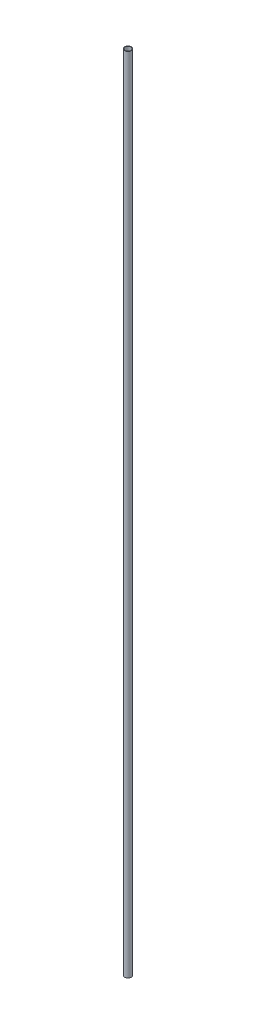
ISO-10303-21;
HEADER;
FILE_DESCRIPTION(('STEP AP214'),'2;1');
FILE_NAME('part.step','',(''),(''),'','','');
FILE_SCHEMA(('AUTOMOTIVE_DESIGN { 1 0 10303 214 1 1 1 1 }'));
ENDSEC;
DATA;
#1=APPLICATION_CONTEXT('core data for automotive mechanical design processes');
#2=APPLICATION_PROTOCOL_DEFINITION('international standard','automotive_design',2000,#1);
#3=PRODUCT_CONTEXT('',#1,'mechanical');
#4=PRODUCT('Part','Part','',(#3));
#5=PRODUCT_RELATED_PRODUCT_CATEGORY('part','',(#4));
#6=PRODUCT_DEFINITION_FORMATION('','',#4);
#7=PRODUCT_DEFINITION_CONTEXT('part definition',#1,'design');
#8=PRODUCT_DEFINITION('design','',#6,#7);
#9=PRODUCT_DEFINITION_SHAPE('','',#8);
#10=(LENGTH_UNIT() NAMED_UNIT(*) SI_UNIT(.MILLI.,.METRE.));
#11=(NAMED_UNIT(*) PLANE_ANGLE_UNIT() SI_UNIT($,.RADIAN.));
#12=(NAMED_UNIT(*) SI_UNIT($,.STERADIAN.) SOLID_ANGLE_UNIT());
#13=UNCERTAINTY_MEASURE_WITH_UNIT(LENGTH_MEASURE(1.E-05),#10,'distance_accuracy_value','');
#14=(GEOMETRIC_REPRESENTATION_CONTEXT(3) GLOBAL_UNCERTAINTY_ASSIGNED_CONTEXT((#13)) GLOBAL_UNIT_ASSIGNED_CONTEXT((#10,
#11,#12)) REPRESENTATION_CONTEXT('',''));
#15=CARTESIAN_POINT('',(0.,0.,0.));
#16=DIRECTION('',(0.,0.,1.));
#17=DIRECTION('',(1.,0.,0.));
#18=AXIS2_PLACEMENT_3D('',#15,#16,#17);
#19=CARTESIAN_POINT('',(0.,955.88,0.));
#20=DIRECTION('',(0.,1.,0.));
#21=DIRECTION('',(0.,0.,1.));
#22=AXIS2_PLACEMENT_3D('',#19,#20,#21);
#23=PLANE('',#22);
#24=CARTESIAN_POINT('',(0.,955.88,0.));
#25=DIRECTION('',(0.,1.,0.));
#26=DIRECTION('',(0.,0.,1.));
#27=AXIS2_PLACEMENT_3D('',#24,#25,#26);
#28=CIRCLE('',#27,4.);
#29=CARTESIAN_POINT('',(0.,955.88,4.));
#30=VERTEX_POINT('',#29);
#31=EDGE_CURVE('E10',#30,#30,#28,.T.);
#32=ORIENTED_EDGE('',*,*,#31,.T.);
#33=EDGE_LOOP('',(#32));
#34=FACE_BOUND('',#33,.T.);
#35=CARTESIAN_POINT('',(0.,955.88,0.));
#36=DIRECTION('',(0.,1.,0.));
#37=DIRECTION('',(0.,0.,1.));
#38=AXIS2_PLACEMENT_3D('',#35,#36,#37);
#39=CIRCLE('',#38,3.5);
#40=CARTESIAN_POINT('',(0.,955.88,3.5));
#41=VERTEX_POINT('',#40);
#42=EDGE_CURVE('E41',#41,#41,#39,.T.);
#43=ORIENTED_EDGE('',*,*,#42,.F.);
#44=EDGE_LOOP('',(#43));
#45=FACE_BOUND('',#44,.T.);
#46=ADVANCED_FACE('F30',(#34,#45),#23,.T.);
#47=CARTESIAN_POINT('',(0.,0.,0.));
#48=DIRECTION('',(0.,1.,0.));
#49=DIRECTION('',(0.,0.,1.));
#50=AXIS2_PLACEMENT_3D('',#47,#48,#49);
#51=PLANE('',#50);
#52=CARTESIAN_POINT('',(0.,0.,0.));
#53=DIRECTION('',(0.,1.,0.));
#54=DIRECTION('',(0.,0.,1.));
#55=AXIS2_PLACEMENT_3D('',#52,#53,#54);
#56=CIRCLE('',#55,4.);
#57=CARTESIAN_POINT('',(0.,0.,4.));
#58=VERTEX_POINT('',#57);
#59=EDGE_CURVE('E34',#58,#58,#56,.T.);
#60=ORIENTED_EDGE('',*,*,#59,.F.);
#61=EDGE_LOOP('',(#60));
#62=FACE_BOUND('',#61,.T.);
#63=CARTESIAN_POINT('',(0.,0.,0.));
#64=DIRECTION('',(0.,1.,0.));
#65=DIRECTION('',(0.,0.,1.));
#66=AXIS2_PLACEMENT_3D('',#63,#64,#65);
#67=CIRCLE('',#66,3.5);
#68=CARTESIAN_POINT('',(0.,0.,3.5));
#69=VERTEX_POINT('',#68);
#70=EDGE_CURVE('E43',#69,#69,#67,.T.);
#71=ORIENTED_EDGE('',*,*,#70,.T.);
#72=EDGE_LOOP('',(#71));
#73=FACE_BOUND('',#72,.T.);
#74=ADVANCED_FACE('F53',(#62,#73),#51,.F.);
#75=CARTESIAN_POINT('',(0.,955.88,0.));
#76=DIRECTION('',(0.,-1.,0.));
#77=DIRECTION('',(0.,0.,-1.));
#78=AXIS2_PLACEMENT_3D('',#75,#76,#77);
#79=CYLINDRICAL_SURFACE('',#78,4.);
#80=ORIENTED_EDGE('',*,*,#31,.F.);
#81=EDGE_LOOP('',(#80));
#82=FACE_BOUND('',#81,.T.);
#83=ORIENTED_EDGE('',*,*,#59,.T.);
#84=EDGE_LOOP('',(#83));
#85=FACE_BOUND('',#84,.T.);
#86=ADVANCED_FACE('F32',(#82,#85),#79,.T.);
#87=CARTESIAN_POINT('',(0.,955.88,0.));
#88=DIRECTION('',(0.,-1.,0.));
#89=DIRECTION('',(0.,0.,-1.));
#90=AXIS2_PLACEMENT_3D('',#87,#88,#89);
#91=CYLINDRICAL_SURFACE('',#90,3.5);
#92=ORIENTED_EDGE('',*,*,#42,.T.);
#93=EDGE_LOOP('',(#92));
#94=FACE_BOUND('',#93,.T.);
#95=ORIENTED_EDGE('',*,*,#70,.F.);
#96=EDGE_LOOP('',(#95));
#97=FACE_BOUND('',#96,.T.);
#98=ADVANCED_FACE('F49',(#94,#97),#91,.F.);
#99=CLOSED_SHELL('',(#46,#74,#86,#98));
#100=MANIFOLD_SOLID_BREP('B2',#99);
#101=ADVANCED_BREP_SHAPE_REPRESENTATION('',(#18,#100),#14);
#102=SHAPE_DEFINITION_REPRESENTATION(#9,#101);
ENDSEC;
END-ISO-10303-21;
